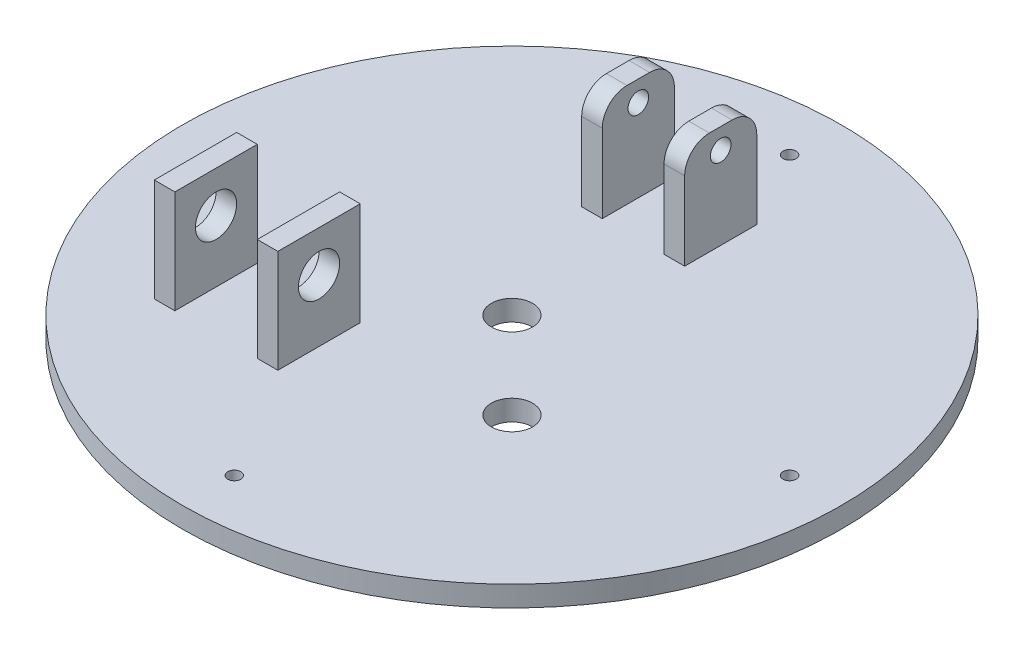
ISO-10303-21;
HEADER;
FILE_DESCRIPTION(('STEP AP214'),'2;1');
FILE_NAME('part.step','',(''),(''),'','','');
FILE_SCHEMA(('AUTOMOTIVE_DESIGN { 1 0 10303 214 1 1 1 1 }'));
ENDSEC;
DATA;
#1=APPLICATION_CONTEXT('core data for automotive mechanical design processes');
#2=APPLICATION_PROTOCOL_DEFINITION('international standard','automotive_design',2000,#1);
#3=PRODUCT_CONTEXT('',#1,'mechanical');
#4=PRODUCT('Part','Part','',(#3));
#5=PRODUCT_RELATED_PRODUCT_CATEGORY('part','',(#4));
#6=PRODUCT_DEFINITION_FORMATION('','',#4);
#7=PRODUCT_DEFINITION_CONTEXT('part definition',#1,'design');
#8=PRODUCT_DEFINITION('design','',#6,#7);
#9=PRODUCT_DEFINITION_SHAPE('','',#8);
#10=(LENGTH_UNIT() NAMED_UNIT(*) SI_UNIT(.MILLI.,.METRE.));
#11=(NAMED_UNIT(*) PLANE_ANGLE_UNIT() SI_UNIT($,.RADIAN.));
#12=(NAMED_UNIT(*) SI_UNIT($,.STERADIAN.) SOLID_ANGLE_UNIT());
#13=UNCERTAINTY_MEASURE_WITH_UNIT(LENGTH_MEASURE(1.E-05),#10,'distance_accuracy_value','');
#14=(GEOMETRIC_REPRESENTATION_CONTEXT(3) GLOBAL_UNCERTAINTY_ASSIGNED_CONTEXT((#13)) GLOBAL_UNIT_ASSIGNED_CONTEXT((#10,
#11,#12)) REPRESENTATION_CONTEXT('',''));
#15=CARTESIAN_POINT('',(0.,0.,0.));
#16=DIRECTION('',(0.,0.,1.));
#17=DIRECTION('',(1.,0.,0.));
#18=AXIS2_PLACEMENT_3D('',#15,#16,#17);
#19=CARTESIAN_POINT('',(0.,6.35,0.));
#20=DIRECTION('',(0.,1.,0.));
#21=DIRECTION('',(0.,0.,1.));
#22=AXIS2_PLACEMENT_3D('',#19,#20,#21);
#23=PLANE('',#22);
#24=CARTESIAN_POINT('',(26.6623804234543,6.35,26.6623804234543));
#25=DIRECTION('',(0.,1.,0.));
#26=DIRECTION('',(0.,0.,1.));
#27=AXIS2_PLACEMENT_3D('',#24,#25,#26);
#28=CIRCLE('',#27,6.35000000000001);
#29=CARTESIAN_POINT('',(26.6623804234543,6.35,33.0123804234543));
#30=VERTEX_POINT('',#29);
#31=EDGE_CURVE('E519',#30,#30,#28,.T.);
#32=ORIENTED_EDGE('',*,*,#31,.F.);
#33=EDGE_LOOP('',(#32));
#34=FACE_BOUND('',#33,.T.);
#35=CARTESIAN_POINT('',(0.,6.35,85.5998013460312));
#36=DIRECTION('',(0.,1.,0.));
#37=DIRECTION('',(0.,0.,1.));
#38=AXIS2_PLACEMENT_3D('',#35,#36,#37);
#39=CIRCLE('',#38,2.0193);
#40=CARTESIAN_POINT('',(0.,6.35,87.6191013460312));
#41=VERTEX_POINT('',#40);
#42=EDGE_CURVE('E331',#41,#41,#39,.T.);
#43=ORIENTED_EDGE('',*,*,#42,.F.);
#44=EDGE_LOOP('',(#43));
#45=FACE_BOUND('',#44,.T.);
#46=CARTESIAN_POINT('',(85.5998013460311,6.35,0.));
#47=DIRECTION('',(0.,1.,0.));
#48=DIRECTION('',(0.,0.,1.));
#49=AXIS2_PLACEMENT_3D('',#46,#47,#48);
#50=CIRCLE('',#49,2.0193);
#51=CARTESIAN_POINT('',(85.5998013460311,6.35,2.01929999999999));
#52=VERTEX_POINT('',#51);
#53=EDGE_CURVE('E327',#52,#52,#50,.T.);
#54=ORIENTED_EDGE('',*,*,#53,.F.);
#55=EDGE_LOOP('',(#54));
#56=FACE_BOUND('',#55,.T.);
#57=CARTESIAN_POINT('',(0.,6.35,-85.5998013460312));
#58=DIRECTION('',(0.,1.,0.));
#59=DIRECTION('',(0.,0.,1.));
#60=AXIS2_PLACEMENT_3D('',#57,#58,#59);
#61=CIRCLE('',#60,2.0193);
#62=CARTESIAN_POINT('',(0.,6.35,-83.5805013460312));
#63=VERTEX_POINT('',#62);
#64=EDGE_CURVE('E323',#63,#63,#61,.T.);
#65=ORIENTED_EDGE('',*,*,#64,.F.);
#66=EDGE_LOOP('',(#65));
#67=FACE_BOUND('',#66,.T.);
#68=CARTESIAN_POINT('',(-85.5998013460312,6.35,0.));
#69=DIRECTION('',(0.,1.,0.));
#70=DIRECTION('',(0.,0.,1.));
#71=AXIS2_PLACEMENT_3D('',#68,#69,#70);
#72=CIRCLE('',#71,2.0193);
#73=CARTESIAN_POINT('',(-85.5998013460312,6.35,2.01930000000001));
#74=VERTEX_POINT('',#73);
#75=EDGE_CURVE('E318',#74,#74,#72,.T.);
#76=ORIENTED_EDGE('',*,*,#75,.F.);
#77=EDGE_LOOP('',(#76));
#78=FACE_BOUND('',#77,.T.);
#79=DIRECTION('',(1.,0.,0.));
#80=VECTOR('',#79,1.);
#81=CARTESIAN_POINT('',(-18.18767,6.35,-39.6875));
#82=LINE('',#81,#80);
#83=CARTESIAN_POINT('',(-18.18767,6.35,-39.6875));
#84=VERTEX_POINT('',#83);
#85=CARTESIAN_POINT('',(-11.83767,6.35,-39.6875));
#86=VERTEX_POINT('',#85);
#87=EDGE_CURVE('E220',#84,#86,#82,.T.);
#88=ORIENTED_EDGE('',*,*,#87,.F.);
#89=DIRECTION('',(0.,0.,1.));
#90=VECTOR('',#89,1.);
#91=CARTESIAN_POINT('',(-18.18767,6.35,-39.6875));
#92=LINE('',#91,#90);
#93=CARTESIAN_POINT('',(-18.18767,6.35,-61.9125));
#94=VERTEX_POINT('',#93);
#95=EDGE_CURVE('E183',#94,#84,#92,.T.);
#96=ORIENTED_EDGE('',*,*,#95,.F.);
#97=DIRECTION('',(-1.,0.,0.));
#98=VECTOR('',#97,1.);
#99=CARTESIAN_POINT('',(-18.18767,6.35,-61.9125));
#100=LINE('',#99,#98);
#101=CARTESIAN_POINT('',(-11.83767,6.35,-61.9125));
#102=VERTEX_POINT('',#101);
#103=EDGE_CURVE('E214',#102,#94,#100,.T.);
#104=ORIENTED_EDGE('',*,*,#103,.F.);
#105=DIRECTION('',(0.,0.,-1.));
#106=VECTOR('',#105,1.);
#107=CARTESIAN_POINT('',(-11.83767,6.35,-39.6875));
#108=LINE('',#107,#106);
#109=EDGE_CURVE('E223',#86,#102,#108,.T.);
#110=ORIENTED_EDGE('',*,*,#109,.F.);
#111=EDGE_LOOP('',(#88,#96,#104,#110));
#112=FACE_BOUND('',#111,.T.);
#113=DIRECTION('',(1.,0.,0.));
#114=VECTOR('',#113,1.);
#115=CARTESIAN_POINT('',(-59.46267,6.35,50.8));
#116=LINE('',#115,#114);
#117=CARTESIAN_POINT('',(-59.46267,6.35,50.8));
#118=VERTEX_POINT('',#117);
#119=CARTESIAN_POINT('',(-53.11267,6.35,50.8));
#120=VERTEX_POINT('',#119);
#121=EDGE_CURVE('E290',#118,#120,#116,.T.);
#122=ORIENTED_EDGE('',*,*,#121,.F.);
#123=DIRECTION('',(0.,0.,1.));
#124=VECTOR('',#123,1.);
#125=CARTESIAN_POINT('',(-59.46267,6.35,25.4));
#126=LINE('',#125,#124);
#127=CARTESIAN_POINT('',(-59.46267,6.35,25.4));
#128=VERTEX_POINT('',#127);
#129=EDGE_CURVE('E276',#128,#118,#126,.T.);
#130=ORIENTED_EDGE('',*,*,#129,.F.);
#131=DIRECTION('',(-1.,0.,0.));
#132=VECTOR('',#131,1.);
#133=CARTESIAN_POINT('',(-59.46267,6.35,25.4));
#134=LINE('',#133,#132);
#135=CARTESIAN_POINT('',(-53.11267,6.35,25.4));
#136=VERTEX_POINT('',#135);
#137=EDGE_CURVE('E281',#136,#128,#134,.T.);
#138=ORIENTED_EDGE('',*,*,#137,.F.);
#139=DIRECTION('',(0.,0.,-1.));
#140=VECTOR('',#139,1.);
#141=CARTESIAN_POINT('',(-53.11267,6.35,25.4));
#142=LINE('',#141,#140);
#143=EDGE_CURVE('E292',#120,#136,#142,.T.);
#144=ORIENTED_EDGE('',*,*,#143,.F.);
#145=EDGE_LOOP('',(#122,#130,#138,#144));
#146=FACE_BOUND('',#145,.T.);
#147=CARTESIAN_POINT('',(0.,6.35,0.));
#148=DIRECTION('',(0.,-1.,0.));
#149=DIRECTION('',(0.,0.,-1.));
#150=AXIS2_PLACEMENT_3D('',#147,#148,#149);
#151=CIRCLE('',#150,6.35);
#152=CARTESIAN_POINT('',(0.,6.35,-6.35));
#153=VERTEX_POINT('',#152);
#154=EDGE_CURVE('E306',#153,#153,#151,.T.);
#155=ORIENTED_EDGE('',*,*,#154,.T.);
#156=EDGE_LOOP('',(#155));
#157=FACE_BOUND('',#156,.T.);
#158=CARTESIAN_POINT('',(0.,6.35,0.));
#159=DIRECTION('',(0.,1.,0.));
#160=DIRECTION('',(0.,0.,1.));
#161=AXIS2_PLACEMENT_3D('',#158,#159,#160);
#162=CIRCLE('',#161,101.6);
#163=CARTESIAN_POINT('',(0.,6.35,101.6));
#164=VERTEX_POINT('',#163);
#165=EDGE_CURVE('E312',#164,#164,#162,.T.);
#166=ORIENTED_EDGE('',*,*,#165,.T.);
#167=EDGE_LOOP('',(#166));
#168=FACE_BOUND('',#167,.T.);
#169=DIRECTION('',(1.,0.,0.));
#170=VECTOR('',#169,1.);
#171=CARTESIAN_POINT('',(-27.71267,6.35,50.8));
#172=LINE('',#171,#170);
#173=CARTESIAN_POINT('',(-27.71267,6.35,50.8));
#174=VERTEX_POINT('',#173);
#175=CARTESIAN_POINT('',(-21.36267,6.35,50.8));
#176=VERTEX_POINT('',#175);
#177=EDGE_CURVE('E261',#174,#176,#172,.T.);
#178=ORIENTED_EDGE('',*,*,#177,.F.);
#179=DIRECTION('',(0.,0.,1.));
#180=VECTOR('',#179,1.);
#181=CARTESIAN_POINT('',(-27.71267,6.35,25.4));
#182=LINE('',#181,#180);
#183=CARTESIAN_POINT('',(-27.71267,6.35,25.4));
#184=VERTEX_POINT('',#183);
#185=EDGE_CURVE('E247',#184,#174,#182,.T.);
#186=ORIENTED_EDGE('',*,*,#185,.F.);
#187=DIRECTION('',(-1.,0.,0.));
#188=VECTOR('',#187,1.);
#189=CARTESIAN_POINT('',(-27.71267,6.35,25.4));
#190=LINE('',#189,#188);
#191=CARTESIAN_POINT('',(-21.36267,6.35,25.4));
#192=VERTEX_POINT('',#191);
#193=EDGE_CURVE('E252',#192,#184,#190,.T.);
#194=ORIENTED_EDGE('',*,*,#193,.F.);
#195=DIRECTION('',(0.,0.,-1.));
#196=VECTOR('',#195,1.);
#197=CARTESIAN_POINT('',(-21.36267,6.35,25.4));
#198=LINE('',#197,#196);
#199=EDGE_CURVE('E263',#176,#192,#198,.T.);
#200=ORIENTED_EDGE('',*,*,#199,.F.);
#201=EDGE_LOOP('',(#178,#186,#194,#200));
#202=FACE_BOUND('',#201,.T.);
#203=DIRECTION('',(1.,0.,0.));
#204=VECTOR('',#203,1.);
#205=CARTESIAN_POINT('',(7.21233,6.35,-39.6875));
#206=LINE('',#205,#204);
#207=CARTESIAN_POINT('',(7.21233,6.35,-39.6875));
#208=VERTEX_POINT('',#207);
#209=CARTESIAN_POINT('',(13.56233,6.35,-39.6875));
#210=VERTEX_POINT('',#209);
#211=EDGE_CURVE('E177',#208,#210,#206,.T.);
#212=ORIENTED_EDGE('',*,*,#211,.F.);
#213=DIRECTION('',(0.,0.,1.));
#214=VECTOR('',#213,1.);
#215=CARTESIAN_POINT('',(7.21233,6.35,-61.9125));
#216=LINE('',#215,#214);
#217=CARTESIAN_POINT('',(7.21233,6.35,-61.9125));
#218=VERTEX_POINT('',#217);
#219=EDGE_CURVE('E187',#218,#208,#216,.T.);
#220=ORIENTED_EDGE('',*,*,#219,.F.);
#221=DIRECTION('',(-1.,0.,0.));
#222=VECTOR('',#221,1.);
#223=CARTESIAN_POINT('',(7.21233,6.35,-61.9125));
#224=LINE('',#223,#222);
#225=CARTESIAN_POINT('',(13.56233,6.35,-61.9125));
#226=VERTEX_POINT('',#225);
#227=EDGE_CURVE('E199',#226,#218,#224,.T.);
#228=ORIENTED_EDGE('',*,*,#227,.F.);
#229=DIRECTION('',(0.,0.,-1.));
#230=VECTOR('',#229,1.);
#231=CARTESIAN_POINT('',(13.56233,6.35,-61.9125));
#232=LINE('',#231,#230);
#233=EDGE_CURVE('E197',#210,#226,#232,.T.);
#234=ORIENTED_EDGE('',*,*,#233,.F.);
#235=EDGE_LOOP('',(#212,#220,#228,#234));
#236=FACE_BOUND('',#235,.T.);
#237=ADVANCED_FACE('F35',(#34,#45,#56,#67,#78,#112,#146,#157,#168,#202,#236),#23,.T.);
#238=CARTESIAN_POINT('',(0.,6.35,0.));
#239=DIRECTION('',(0.,-1.,0.));
#240=DIRECTION('',(0.,0.,-1.));
#241=AXIS2_PLACEMENT_3D('',#238,#239,#240);
#242=CYLINDRICAL_SURFACE('',#241,101.6);
#243=ORIENTED_EDGE('',*,*,#165,.F.);
#244=EDGE_LOOP('',(#243));
#245=FACE_BOUND('',#244,.T.);
#246=CARTESIAN_POINT('',(0.,0.,0.));
#247=DIRECTION('',(0.,1.,0.));
#248=DIRECTION('',(0.,0.,1.));
#249=AXIS2_PLACEMENT_3D('',#246,#247,#248);
#250=CIRCLE('',#249,101.6);
#251=CARTESIAN_POINT('',(0.,0.,101.6));
#252=VERTEX_POINT('',#251);
#253=EDGE_CURVE('E309',#252,#252,#250,.T.);
#254=ORIENTED_EDGE('',*,*,#253,.T.);
#255=EDGE_LOOP('',(#254));
#256=FACE_BOUND('',#255,.T.);
#257=ADVANCED_FACE('F388',(#245,#256),#242,.T.);
#258=CARTESIAN_POINT('',(0.,0.,0.));
#259=DIRECTION('',(0.,1.,0.));
#260=DIRECTION('',(0.,0.,1.));
#261=AXIS2_PLACEMENT_3D('',#258,#259,#260);
#262=PLANE('',#261);
#263=CARTESIAN_POINT('',(26.6623804234543,0.,26.6623804234543));
#264=DIRECTION('',(0.,1.,0.));
#265=DIRECTION('',(0.,0.,1.));
#266=AXIS2_PLACEMENT_3D('',#263,#264,#265);
#267=CIRCLE('',#266,6.35000000000001);
#268=CARTESIAN_POINT('',(26.6623804234543,0.,33.0123804234543));
#269=VERTEX_POINT('',#268);
#270=EDGE_CURVE('E518',#269,#269,#267,.T.);
#271=ORIENTED_EDGE('',*,*,#270,.T.);
#272=EDGE_LOOP('',(#271));
#273=FACE_BOUND('',#272,.T.);
#274=CARTESIAN_POINT('',(0.,0.,85.5998013460312));
#275=DIRECTION('',(0.,-1.,0.));
#276=DIRECTION('',(0.,0.,-1.));
#277=AXIS2_PLACEMENT_3D('',#274,#275,#276);
#278=CIRCLE('',#277,2.0193);
#279=CARTESIAN_POINT('',(0.,0.,83.5805013460312));
#280=VERTEX_POINT('',#279);
#281=EDGE_CURVE('E334',#280,#280,#278,.T.);
#282=ORIENTED_EDGE('',*,*,#281,.F.);
#283=EDGE_LOOP('',(#282));
#284=FACE_BOUND('',#283,.T.);
#285=CARTESIAN_POINT('',(85.5998013460311,0.,0.));
#286=DIRECTION('',(0.,-1.,0.));
#287=DIRECTION('',(0.,0.,-1.));
#288=AXIS2_PLACEMENT_3D('',#285,#286,#287);
#289=CIRCLE('',#288,2.0193);
#290=CARTESIAN_POINT('',(85.5998013460311,0.,-2.01930000000002));
#291=VERTEX_POINT('',#290);
#292=EDGE_CURVE('E330',#291,#291,#289,.T.);
#293=ORIENTED_EDGE('',*,*,#292,.F.);
#294=EDGE_LOOP('',(#293));
#295=FACE_BOUND('',#294,.T.);
#296=CARTESIAN_POINT('',(0.,0.,-85.5998013460312));
#297=DIRECTION('',(0.,-1.,0.));
#298=DIRECTION('',(0.,0.,-1.));
#299=AXIS2_PLACEMENT_3D('',#296,#297,#298);
#300=CIRCLE('',#299,2.0193);
#301=CARTESIAN_POINT('',(0.,0.,-87.6191013460312));
#302=VERTEX_POINT('',#301);
#303=EDGE_CURVE('E326',#302,#302,#300,.T.);
#304=ORIENTED_EDGE('',*,*,#303,.F.);
#305=EDGE_LOOP('',(#304));
#306=FACE_BOUND('',#305,.T.);
#307=CARTESIAN_POINT('',(-85.5998013460312,0.,0.));
#308=DIRECTION('',(0.,-1.,0.));
#309=DIRECTION('',(0.,0.,-1.));
#310=AXIS2_PLACEMENT_3D('',#307,#308,#309);
#311=CIRCLE('',#310,2.0193);
#312=CARTESIAN_POINT('',(-85.5998013460312,0.,-2.01929999999999));
#313=VERTEX_POINT('',#312);
#314=EDGE_CURVE('E322',#313,#313,#311,.T.);
#315=ORIENTED_EDGE('',*,*,#314,.F.);
#316=EDGE_LOOP('',(#315));
#317=FACE_BOUND('',#316,.T.);
#318=CARTESIAN_POINT('',(0.,0.,0.));
#319=DIRECTION('',(0.,-1.,0.));
#320=DIRECTION('',(0.,0.,-1.));
#321=AXIS2_PLACEMENT_3D('',#318,#319,#320);
#322=CIRCLE('',#321,6.35);
#323=CARTESIAN_POINT('',(0.,0.,-6.35));
#324=VERTEX_POINT('',#323);
#325=EDGE_CURVE('E305',#324,#324,#322,.T.);
#326=ORIENTED_EDGE('',*,*,#325,.F.);
#327=EDGE_LOOP('',(#326));
#328=FACE_BOUND('',#327,.T.);
#329=ORIENTED_EDGE('',*,*,#253,.F.);
#330=EDGE_LOOP('',(#329));
#331=FACE_BOUND('',#330,.T.);
#332=ADVANCED_FACE('F459',(#273,#284,#295,#306,#317,#328,#331),#262,.F.);
#333=CARTESIAN_POINT('',(0.,6.35,0.));
#334=DIRECTION('',(0.,-1.,0.));
#335=DIRECTION('',(0.,0.,-1.));
#336=AXIS2_PLACEMENT_3D('',#333,#334,#335);
#337=CYLINDRICAL_SURFACE('',#336,6.35);
#338=ORIENTED_EDGE('',*,*,#154,.F.);
#339=EDGE_LOOP('',(#338));
#340=FACE_BOUND('',#339,.T.);
#341=ORIENTED_EDGE('',*,*,#325,.T.);
#342=EDGE_LOOP('',(#341));
#343=FACE_BOUND('',#342,.T.);
#344=ADVANCED_FACE('F456',(#340,#343),#337,.F.);
#345=CARTESIAN_POINT('',(-59.46267,38.1,25.4));
#346=DIRECTION('',(1.,0.,0.));
#347=DIRECTION('',(0.,0.,-1.));
#348=AXIS2_PLACEMENT_3D('',#345,#346,#347);
#349=PLANE('',#348);
#350=CARTESIAN_POINT('',(-59.46267,25.4,38.1));
#351=DIRECTION('',(1.,0.,0.));
#352=DIRECTION('',(0.,0.,-1.));
#353=AXIS2_PLACEMENT_3D('',#350,#351,#352);
#354=CIRCLE('',#353,6.35);
#355=CARTESIAN_POINT('',(-59.46267,25.4,31.75));
#356=VERTEX_POINT('',#355);
#357=EDGE_CURVE('E238',#356,#356,#354,.F.);
#358=ORIENTED_EDGE('',*,*,#357,.F.);
#359=EDGE_LOOP('',(#358));
#360=FACE_BOUND('',#359,.T.);
#361=ORIENTED_EDGE('',*,*,#129,.T.);
#362=DIRECTION('',(0.,-1.,0.));
#363=VECTOR('',#362,1.);
#364=CARTESIAN_POINT('',(-59.46267,38.1,50.8));
#365=LINE('',#364,#363);
#366=CARTESIAN_POINT('',(-59.46267,38.1,50.8));
#367=VERTEX_POINT('',#366);
#368=EDGE_CURVE('E303',#367,#118,#365,.T.);
#369=ORIENTED_EDGE('',*,*,#368,.F.);
#370=DIRECTION('',(0.,0.,1.));
#371=VECTOR('',#370,1.);
#372=CARTESIAN_POINT('',(-59.46267,38.1,25.4));
#373=LINE('',#372,#371);
#374=CARTESIAN_POINT('',(-59.46267,38.1,25.4));
#375=VERTEX_POINT('',#374);
#376=EDGE_CURVE('E277',#375,#367,#373,.T.);
#377=ORIENTED_EDGE('',*,*,#376,.F.);
#378=DIRECTION('',(0.,-1.,0.));
#379=VECTOR('',#378,1.);
#380=CARTESIAN_POINT('',(-59.46267,38.1,25.4));
#381=LINE('',#380,#379);
#382=EDGE_CURVE('E287',#375,#128,#381,.T.);
#383=ORIENTED_EDGE('',*,*,#382,.T.);
#384=EDGE_LOOP('',(#361,#369,#377,#383));
#385=FACE_BOUND('',#384,.T.);
#386=ADVANCED_FACE('F452',(#360,#385),#349,.F.);
#387=CARTESIAN_POINT('',(-59.46267,38.1,50.8));
#388=DIRECTION('',(0.,0.,-1.));
#389=DIRECTION('',(-1.,0.,0.));
#390=AXIS2_PLACEMENT_3D('',#387,#388,#389);
#391=PLANE('',#390);
#392=ORIENTED_EDGE('',*,*,#121,.T.);
#393=DIRECTION('',(0.,-1.,0.));
#394=VECTOR('',#393,1.);
#395=CARTESIAN_POINT('',(-53.11267,38.1,50.8));
#396=LINE('',#395,#394);
#397=CARTESIAN_POINT('',(-53.11267,38.1,50.8));
#398=VERTEX_POINT('',#397);
#399=EDGE_CURVE('E300',#398,#120,#396,.T.);
#400=ORIENTED_EDGE('',*,*,#399,.F.);
#401=DIRECTION('',(1.,0.,0.));
#402=VECTOR('',#401,1.);
#403=CARTESIAN_POINT('',(-59.46267,38.1,50.8));
#404=LINE('',#403,#402);
#405=EDGE_CURVE('E280',#367,#398,#404,.T.);
#406=ORIENTED_EDGE('',*,*,#405,.F.);
#407=ORIENTED_EDGE('',*,*,#368,.T.);
#408=EDGE_LOOP('',(#392,#400,#406,#407));
#409=FACE_BOUND('',#408,.T.);
#410=ADVANCED_FACE('F448',(#409),#391,.F.);
#411=CARTESIAN_POINT('',(-53.11267,38.1,25.4));
#412=DIRECTION('',(-1.,0.,0.));
#413=DIRECTION('',(0.,0.,1.));
#414=AXIS2_PLACEMENT_3D('',#411,#412,#413);
#415=PLANE('',#414);
#416=CARTESIAN_POINT('',(-53.11267,25.4,38.1));
#417=DIRECTION('',(-1.,0.,0.));
#418=DIRECTION('',(0.,0.,1.));
#419=AXIS2_PLACEMENT_3D('',#416,#417,#418);
#420=CIRCLE('',#419,6.35);
#421=CARTESIAN_POINT('',(-53.11267,25.4,44.45));
#422=VERTEX_POINT('',#421);
#423=EDGE_CURVE('E244',#422,#422,#420,.T.);
#424=ORIENTED_EDGE('',*,*,#423,.T.);
#425=EDGE_LOOP('',(#424));
#426=FACE_BOUND('',#425,.T.);
#427=ORIENTED_EDGE('',*,*,#143,.T.);
#428=DIRECTION('',(0.,-1.,0.));
#429=VECTOR('',#428,1.);
#430=CARTESIAN_POINT('',(-53.11267,38.1,25.4));
#431=LINE('',#430,#429);
#432=CARTESIAN_POINT('',(-53.11267,38.1,25.4));
#433=VERTEX_POINT('',#432);
#434=EDGE_CURVE('E298',#433,#136,#431,.T.);
#435=ORIENTED_EDGE('',*,*,#434,.F.);
#436=DIRECTION('',(0.,0.,-1.));
#437=VECTOR('',#436,1.);
#438=CARTESIAN_POINT('',(-53.11267,38.1,25.4));
#439=LINE('',#438,#437);
#440=EDGE_CURVE('E283',#398,#433,#439,.T.);
#441=ORIENTED_EDGE('',*,*,#440,.F.);
#442=ORIENTED_EDGE('',*,*,#399,.T.);
#443=EDGE_LOOP('',(#427,#435,#441,#442));
#444=FACE_BOUND('',#443,.T.);
#445=ADVANCED_FACE('F444',(#426,#444),#415,.F.);
#446=CARTESIAN_POINT('',(-59.46267,38.1,25.4));
#447=DIRECTION('',(0.,0.,1.));
#448=DIRECTION('',(1.,0.,0.));
#449=AXIS2_PLACEMENT_3D('',#446,#447,#448);
#450=PLANE('',#449);
#451=ORIENTED_EDGE('',*,*,#137,.T.);
#452=ORIENTED_EDGE('',*,*,#382,.F.);
#453=DIRECTION('',(-1.,0.,0.));
#454=VECTOR('',#453,1.);
#455=CARTESIAN_POINT('',(-59.46267,38.1,25.4));
#456=LINE('',#455,#454);
#457=EDGE_CURVE('E285',#433,#375,#456,.T.);
#458=ORIENTED_EDGE('',*,*,#457,.F.);
#459=ORIENTED_EDGE('',*,*,#434,.T.);
#460=EDGE_LOOP('',(#451,#452,#458,#459));
#461=FACE_BOUND('',#460,.T.);
#462=ADVANCED_FACE('F440',(#461),#450,.F.);
#463=CARTESIAN_POINT('',(0.,38.1,0.));
#464=DIRECTION('',(0.,1.,0.));
#465=DIRECTION('',(0.,0.,1.));
#466=AXIS2_PLACEMENT_3D('',#463,#464,#465);
#467=PLANE('',#466);
#468=ORIENTED_EDGE('',*,*,#376,.T.);
#469=ORIENTED_EDGE('',*,*,#405,.T.);
#470=ORIENTED_EDGE('',*,*,#440,.T.);
#471=ORIENTED_EDGE('',*,*,#457,.T.);
#472=EDGE_LOOP('',(#468,#469,#470,#471));
#473=FACE_BOUND('',#472,.T.);
#474=ADVANCED_FACE('F436',(#473),#467,.T.);
#475=CARTESIAN_POINT('',(-27.71267,38.1,25.4));
#476=DIRECTION('',(1.,0.,0.));
#477=DIRECTION('',(0.,0.,-1.));
#478=AXIS2_PLACEMENT_3D('',#475,#476,#477);
#479=PLANE('',#478);
#480=CARTESIAN_POINT('',(-27.71267,25.4,38.1));
#481=DIRECTION('',(1.,0.,0.));
#482=DIRECTION('',(0.,0.,-1.));
#483=AXIS2_PLACEMENT_3D('',#480,#481,#482);
#484=CIRCLE('',#483,6.35);
#485=CARTESIAN_POINT('',(-27.71267,25.4,31.75));
#486=VERTEX_POINT('',#485);
#487=EDGE_CURVE('E241',#486,#486,#484,.T.);
#488=ORIENTED_EDGE('',*,*,#487,.T.);
#489=EDGE_LOOP('',(#488));
#490=FACE_BOUND('',#489,.T.);
#491=ORIENTED_EDGE('',*,*,#185,.T.);
#492=DIRECTION('',(0.,-1.,0.));
#493=VECTOR('',#492,1.);
#494=CARTESIAN_POINT('',(-27.71267,38.1,50.8));
#495=LINE('',#494,#493);
#496=CARTESIAN_POINT('',(-27.71267,38.1,50.8));
#497=VERTEX_POINT('',#496);
#498=EDGE_CURVE('E274',#497,#174,#495,.T.);
#499=ORIENTED_EDGE('',*,*,#498,.F.);
#500=DIRECTION('',(0.,0.,1.));
#501=VECTOR('',#500,1.);
#502=CARTESIAN_POINT('',(-27.71267,38.1,25.4));
#503=LINE('',#502,#501);
#504=CARTESIAN_POINT('',(-27.71267,38.1,25.4));
#505=VERTEX_POINT('',#504);
#506=EDGE_CURVE('E248',#505,#497,#503,.T.);
#507=ORIENTED_EDGE('',*,*,#506,.F.);
#508=DIRECTION('',(0.,-1.,0.));
#509=VECTOR('',#508,1.);
#510=CARTESIAN_POINT('',(-27.71267,38.1,25.4));
#511=LINE('',#510,#509);
#512=EDGE_CURVE('E258',#505,#184,#511,.T.);
#513=ORIENTED_EDGE('',*,*,#512,.T.);
#514=EDGE_LOOP('',(#491,#499,#507,#513));
#515=FACE_BOUND('',#514,.T.);
#516=ADVANCED_FACE('F417',(#490,#515),#479,.F.);
#517=CARTESIAN_POINT('',(-27.71267,38.1,50.8));
#518=DIRECTION('',(0.,0.,-1.));
#519=DIRECTION('',(-1.,0.,0.));
#520=AXIS2_PLACEMENT_3D('',#517,#518,#519);
#521=PLANE('',#520);
#522=ORIENTED_EDGE('',*,*,#177,.T.);
#523=DIRECTION('',(0.,-1.,0.));
#524=VECTOR('',#523,1.);
#525=CARTESIAN_POINT('',(-21.36267,38.1,50.8));
#526=LINE('',#525,#524);
#527=CARTESIAN_POINT('',(-21.36267,38.1,50.8));
#528=VERTEX_POINT('',#527);
#529=EDGE_CURVE('E271',#528,#176,#526,.T.);
#530=ORIENTED_EDGE('',*,*,#529,.F.);
#531=DIRECTION('',(1.,0.,0.));
#532=VECTOR('',#531,1.);
#533=CARTESIAN_POINT('',(-27.71267,38.1,50.8));
#534=LINE('',#533,#532);
#535=EDGE_CURVE('E251',#497,#528,#534,.T.);
#536=ORIENTED_EDGE('',*,*,#535,.F.);
#537=ORIENTED_EDGE('',*,*,#498,.T.);
#538=EDGE_LOOP('',(#522,#530,#536,#537));
#539=FACE_BOUND('',#538,.T.);
#540=ADVANCED_FACE('F405',(#539),#521,.F.);
#541=CARTESIAN_POINT('',(-21.36267,38.1,25.4));
#542=DIRECTION('',(-1.,0.,0.));
#543=DIRECTION('',(0.,0.,1.));
#544=AXIS2_PLACEMENT_3D('',#541,#542,#543);
#545=PLANE('',#544);
#546=CARTESIAN_POINT('',(-21.36267,25.4,38.1));
#547=DIRECTION('',(1.,0.,0.));
#548=DIRECTION('',(0.,0.,-1.));
#549=AXIS2_PLACEMENT_3D('',#546,#547,#548);
#550=CIRCLE('',#549,6.35);
#551=CARTESIAN_POINT('',(-21.36267,25.4,31.75));
#552=VERTEX_POINT('',#551);
#553=EDGE_CURVE('E235',#552,#552,#550,.T.);
#554=ORIENTED_EDGE('',*,*,#553,.F.);
#555=EDGE_LOOP('',(#554));
#556=FACE_BOUND('',#555,.T.);
#557=ORIENTED_EDGE('',*,*,#199,.T.);
#558=DIRECTION('',(0.,-1.,0.));
#559=VECTOR('',#558,1.);
#560=CARTESIAN_POINT('',(-21.36267,38.1,25.4));
#561=LINE('',#560,#559);
#562=CARTESIAN_POINT('',(-21.36267,38.1,25.4));
#563=VERTEX_POINT('',#562);
#564=EDGE_CURVE('E269',#563,#192,#561,.T.);
#565=ORIENTED_EDGE('',*,*,#564,.F.);
#566=DIRECTION('',(0.,0.,-1.));
#567=VECTOR('',#566,1.);
#568=CARTESIAN_POINT('',(-21.36267,38.1,25.4));
#569=LINE('',#568,#567);
#570=EDGE_CURVE('E254',#528,#563,#569,.T.);
#571=ORIENTED_EDGE('',*,*,#570,.F.);
#572=ORIENTED_EDGE('',*,*,#529,.T.);
#573=EDGE_LOOP('',(#557,#565,#571,#572));
#574=FACE_BOUND('',#573,.T.);
#575=ADVANCED_FACE('F409',(#556,#574),#545,.F.);
#576=CARTESIAN_POINT('',(-27.71267,38.1,25.4));
#577=DIRECTION('',(0.,0.,1.));
#578=DIRECTION('',(1.,0.,0.));
#579=AXIS2_PLACEMENT_3D('',#576,#577,#578);
#580=PLANE('',#579);
#581=ORIENTED_EDGE('',*,*,#193,.T.);
#582=ORIENTED_EDGE('',*,*,#512,.F.);
#583=DIRECTION('',(-1.,0.,0.));
#584=VECTOR('',#583,1.);
#585=CARTESIAN_POINT('',(-27.71267,38.1,25.4));
#586=LINE('',#585,#584);
#587=EDGE_CURVE('E256',#563,#505,#586,.T.);
#588=ORIENTED_EDGE('',*,*,#587,.F.);
#589=ORIENTED_EDGE('',*,*,#564,.T.);
#590=EDGE_LOOP('',(#581,#582,#588,#589));
#591=FACE_BOUND('',#590,.T.);
#592=ADVANCED_FACE('F419',(#591),#580,.F.);
#593=CARTESIAN_POINT('',(0.,38.1,0.));
#594=DIRECTION('',(0.,1.,0.));
#595=DIRECTION('',(0.,0.,1.));
#596=AXIS2_PLACEMENT_3D('',#593,#594,#595);
#597=PLANE('',#596);
#598=ORIENTED_EDGE('',*,*,#506,.T.);
#599=ORIENTED_EDGE('',*,*,#535,.T.);
#600=ORIENTED_EDGE('',*,*,#570,.T.);
#601=ORIENTED_EDGE('',*,*,#587,.T.);
#602=EDGE_LOOP('',(#598,#599,#600,#601));
#603=FACE_BOUND('',#602,.T.);
#604=ADVANCED_FACE('F413',(#603),#597,.T.);
#605=CARTESIAN_POINT('',(-77.4231822421383,25.4,38.1));
#606=DIRECTION('',(1.,0.,0.));
#607=DIRECTION('',(0.,0.,-1.));
#608=AXIS2_PLACEMENT_3D('',#605,#606,#607);
#609=CYLINDRICAL_SURFACE('',#608,6.35);
#610=ORIENTED_EDGE('',*,*,#553,.T.);
#611=EDGE_LOOP('',(#610));
#612=FACE_BOUND('',#611,.T.);
#613=ORIENTED_EDGE('',*,*,#487,.F.);
#614=EDGE_LOOP('',(#613));
#615=FACE_BOUND('',#614,.T.);
#616=ADVANCED_FACE('F426',(#612,#615),#609,.F.);
#617=ORIENTED_EDGE('',*,*,#357,.T.);
#618=EDGE_LOOP('',(#617));
#619=FACE_BOUND('',#618,.T.);
#620=ORIENTED_EDGE('',*,*,#423,.F.);
#621=EDGE_LOOP('',(#620));
#622=FACE_BOUND('',#621,.T.);
#623=ADVANCED_FACE('F586',(#619,#622),#609,.F.);
#624=CARTESIAN_POINT('',(-18.18767,38.1,-39.6875));
#625=DIRECTION('',(1.,0.,0.));
#626=DIRECTION('',(0.,0.,-1.));
#627=AXIS2_PLACEMENT_3D('',#624,#625,#626);
#628=PLANE('',#627);
#629=CARTESIAN_POINT('',(-18.18767,31.75,-50.8));
#630=DIRECTION('',(-1.,0.,0.));
#631=DIRECTION('',(0.,0.,1.));
#632=AXIS2_PLACEMENT_3D('',#629,#630,#631);
#633=CIRCLE('',#632,3.175);
#634=CARTESIAN_POINT('',(-18.18767,31.75,-47.625));
#635=VERTEX_POINT('',#634);
#636=EDGE_CURVE('E321',#635,#635,#633,.T.);
#637=ORIENTED_EDGE('',*,*,#636,.F.);
#638=EDGE_LOOP('',(#637));
#639=FACE_BOUND('',#638,.T.);
#640=DIRECTION('',(0.,-1.,0.));
#641=VECTOR('',#640,1.);
#642=CARTESIAN_POINT('',(-18.18767,38.1,-39.6875));
#643=LINE('',#642,#641);
#644=CARTESIAN_POINT('',(-18.18767,30.48,-39.6875));
#645=VERTEX_POINT('',#644);
#646=EDGE_CURVE('E233',#645,#84,#643,.T.);
#647=ORIENTED_EDGE('',*,*,#646,.F.);
#648=CARTESIAN_POINT('',(-18.18767,30.48,-47.3075));
#649=DIRECTION('',(1.,0.,0.));
#650=DIRECTION('',(0.,0.,-1.));
#651=AXIS2_PLACEMENT_3D('',#648,#649,#650);
#652=CIRCLE('',#651,7.62);
#653=CARTESIAN_POINT('',(-18.18767,38.1,-47.3075));
#654=VERTEX_POINT('',#653);
#655=EDGE_CURVE('E361',#645,#654,#652,.F.);
#656=ORIENTED_EDGE('',*,*,#655,.T.);
#657=DIRECTION('',(0.,0.,1.));
#658=VECTOR('',#657,1.);
#659=CARTESIAN_POINT('',(-18.18767,38.1,-39.6875));
#660=LINE('',#659,#658);
#661=CARTESIAN_POINT('',(-18.18767,38.1,-54.2925));
#662=VERTEX_POINT('',#661);
#663=EDGE_CURVE('E210',#662,#654,#660,.T.);
#664=ORIENTED_EDGE('',*,*,#663,.F.);
#665=CARTESIAN_POINT('',(-18.18767,30.48,-54.2925));
#666=DIRECTION('',(1.,0.,0.));
#667=DIRECTION('',(0.,0.,-1.));
#668=AXIS2_PLACEMENT_3D('',#665,#666,#667);
#669=CIRCLE('',#668,7.62);
#670=CARTESIAN_POINT('',(-18.18767,30.48,-61.9125));
#671=VERTEX_POINT('',#670);
#672=EDGE_CURVE('E50',#662,#671,#669,.F.);
#673=ORIENTED_EDGE('',*,*,#672,.T.);
#674=DIRECTION('',(0.,-1.,0.));
#675=VECTOR('',#674,1.);
#676=CARTESIAN_POINT('',(-18.18767,38.1,-61.9125));
#677=LINE('',#676,#675);
#678=EDGE_CURVE('E217',#671,#94,#677,.T.);
#679=ORIENTED_EDGE('',*,*,#678,.T.);
#680=ORIENTED_EDGE('',*,*,#95,.T.);
#681=EDGE_LOOP('',(#647,#656,#664,#673,#679,#680));
#682=FACE_BOUND('',#681,.T.);
#683=ADVANCED_FACE('F378',(#639,#682),#628,.F.);
#684=CARTESIAN_POINT('',(-18.18767,38.1,-39.6875));
#685=DIRECTION('',(0.,0.,-1.));
#686=DIRECTION('',(-1.,0.,0.));
#687=AXIS2_PLACEMENT_3D('',#684,#685,#686);
#688=PLANE('',#687);
#689=DIRECTION('',(0.,-1.,0.));
#690=VECTOR('',#689,1.);
#691=CARTESIAN_POINT('',(-11.83767,38.1,-39.6875));
#692=LINE('',#691,#690);
#693=CARTESIAN_POINT('',(-11.83767,30.48,-39.6875));
#694=VERTEX_POINT('',#693);
#695=EDGE_CURVE('E231',#694,#86,#692,.T.);
#696=ORIENTED_EDGE('',*,*,#695,.F.);
#697=DIRECTION('',(1.,0.,0.));
#698=VECTOR('',#697,1.);
#699=CARTESIAN_POINT('',(-18.18767,30.48,-39.6875));
#700=LINE('',#699,#698);
#701=EDGE_CURVE('E58',#694,#645,#700,.F.);
#702=ORIENTED_EDGE('',*,*,#701,.T.);
#703=ORIENTED_EDGE('',*,*,#646,.T.);
#704=ORIENTED_EDGE('',*,*,#87,.T.);
#705=EDGE_LOOP('',(#696,#702,#703,#704));
#706=FACE_BOUND('',#705,.T.);
#707=ADVANCED_FACE('F382',(#706),#688,.F.);
#708=CARTESIAN_POINT('',(-11.83767,38.1,-39.6875));
#709=DIRECTION('',(-1.,0.,0.));
#710=DIRECTION('',(0.,0.,1.));
#711=AXIS2_PLACEMENT_3D('',#708,#709,#710);
#712=PLANE('',#711);
#713=CARTESIAN_POINT('',(-11.83767,31.75,-50.8));
#714=DIRECTION('',(-1.,0.,0.));
#715=DIRECTION('',(0.,0.,1.));
#716=AXIS2_PLACEMENT_3D('',#713,#714,#715);
#717=CIRCLE('',#716,3.175);
#718=CARTESIAN_POINT('',(-11.83767,31.75,-47.625));
#719=VERTEX_POINT('',#718);
#720=EDGE_CURVE('E194',#719,#719,#717,.T.);
#721=ORIENTED_EDGE('',*,*,#720,.T.);
#722=EDGE_LOOP('',(#721));
#723=FACE_BOUND('',#722,.T.);
#724=DIRECTION('',(0.,0.,-1.));
#725=VECTOR('',#724,1.);
#726=CARTESIAN_POINT('',(-11.83767,38.1,-39.6875));
#727=LINE('',#726,#725);
#728=CARTESIAN_POINT('',(-11.83767,38.1,-47.3075));
#729=VERTEX_POINT('',#728);
#730=CARTESIAN_POINT('',(-11.83767,38.1,-54.2925));
#731=VERTEX_POINT('',#730);
#732=EDGE_CURVE('E213',#729,#731,#727,.T.);
#733=ORIENTED_EDGE('',*,*,#732,.F.);
#734=CARTESIAN_POINT('',(-11.83767,30.48,-47.3075));
#735=DIRECTION('',(-1.,0.,0.));
#736=DIRECTION('',(0.,0.,1.));
#737=AXIS2_PLACEMENT_3D('',#734,#735,#736);
#738=CIRCLE('',#737,7.62);
#739=EDGE_CURVE('E357',#729,#694,#738,.F.);
#740=ORIENTED_EDGE('',*,*,#739,.T.);
#741=ORIENTED_EDGE('',*,*,#695,.T.);
#742=ORIENTED_EDGE('',*,*,#109,.T.);
#743=DIRECTION('',(0.,-1.,0.));
#744=VECTOR('',#743,1.);
#745=CARTESIAN_POINT('',(-11.83767,38.1,-61.9125));
#746=LINE('',#745,#744);
#747=CARTESIAN_POINT('',(-11.83767,30.48,-61.9125));
#748=VERTEX_POINT('',#747);
#749=EDGE_CURVE('E229',#748,#102,#746,.T.);
#750=ORIENTED_EDGE('',*,*,#749,.F.);
#751=CARTESIAN_POINT('',(-11.83767,30.48,-54.2925));
#752=DIRECTION('',(-1.,0.,0.));
#753=DIRECTION('',(0.,0.,1.));
#754=AXIS2_PLACEMENT_3D('',#751,#752,#753);
#755=CIRCLE('',#754,7.62);
#756=EDGE_CURVE('E355',#748,#731,#755,.F.);
#757=ORIENTED_EDGE('',*,*,#756,.T.);
#758=EDGE_LOOP('',(#733,#740,#741,#742,#750,#757));
#759=FACE_BOUND('',#758,.T.);
#760=ADVANCED_FACE('F370',(#723,#759),#712,.F.);
#761=CARTESIAN_POINT('',(-18.18767,38.1,-61.9125));
#762=DIRECTION('',(0.,0.,1.));
#763=DIRECTION('',(1.,0.,0.));
#764=AXIS2_PLACEMENT_3D('',#761,#762,#763);
#765=PLANE('',#764);
#766=ORIENTED_EDGE('',*,*,#678,.F.);
#767=DIRECTION('',(-1.,0.,0.));
#768=VECTOR('',#767,1.);
#769=CARTESIAN_POINT('',(-18.18767,30.48,-61.9125));
#770=LINE('',#769,#768);
#771=EDGE_CURVE('E43',#671,#748,#770,.F.);
#772=ORIENTED_EDGE('',*,*,#771,.T.);
#773=ORIENTED_EDGE('',*,*,#749,.T.);
#774=ORIENTED_EDGE('',*,*,#103,.T.);
#775=EDGE_LOOP('',(#766,#772,#773,#774));
#776=FACE_BOUND('',#775,.T.);
#777=ADVANCED_FACE('F365',(#776),#765,.F.);
#778=CARTESIAN_POINT('',(0.,38.1,0.));
#779=DIRECTION('',(0.,-1.,0.));
#780=DIRECTION('',(0.,0.,-1.));
#781=AXIS2_PLACEMENT_3D('',#778,#779,#780);
#782=PLANE('',#781);
#783=ORIENTED_EDGE('',*,*,#663,.T.);
#784=DIRECTION('',(1.,0.,0.));
#785=VECTOR('',#784,1.);
#786=CARTESIAN_POINT('',(0.,38.1,-47.3075));
#787=LINE('',#786,#785);
#788=EDGE_CURVE('E352',#654,#729,#787,.T.);
#789=ORIENTED_EDGE('',*,*,#788,.T.);
#790=ORIENTED_EDGE('',*,*,#732,.T.);
#791=DIRECTION('',(-1.,0.,0.));
#792=VECTOR('',#791,1.);
#793=CARTESIAN_POINT('',(0.,38.1,-54.2925));
#794=LINE('',#793,#792);
#795=EDGE_CURVE('E349',#731,#662,#794,.T.);
#796=ORIENTED_EDGE('',*,*,#795,.T.);
#797=EDGE_LOOP('',(#783,#789,#790,#796));
#798=FACE_BOUND('',#797,.T.);
#799=ADVANCED_FACE('F376',(#798),#782,.F.);
#800=CARTESIAN_POINT('',(7.21233,38.1,-61.9125));
#801=DIRECTION('',(1.,0.,0.));
#802=DIRECTION('',(0.,0.,-1.));
#803=AXIS2_PLACEMENT_3D('',#800,#801,#802);
#804=PLANE('',#803);
#805=CARTESIAN_POINT('',(7.21233,31.75,-50.8));
#806=DIRECTION('',(1.,0.,0.));
#807=DIRECTION('',(0.,0.,-1.));
#808=AXIS2_PLACEMENT_3D('',#805,#806,#807);
#809=CIRCLE('',#808,3.175);
#810=CARTESIAN_POINT('',(7.21233,31.75,-53.975));
#811=VERTEX_POINT('',#810);
#812=EDGE_CURVE('E502',#811,#811,#809,.T.);
#813=ORIENTED_EDGE('',*,*,#812,.T.);
#814=EDGE_LOOP('',(#813));
#815=FACE_BOUND('',#814,.T.);
#816=DIRECTION('',(0.,-1.,0.));
#817=VECTOR('',#816,1.);
#818=CARTESIAN_POINT('',(7.21233,38.1,-39.6875));
#819=LINE('',#818,#817);
#820=CARTESIAN_POINT('',(7.21233,30.48,-39.6875));
#821=VERTEX_POINT('',#820);
#822=EDGE_CURVE('E172',#821,#208,#819,.T.);
#823=ORIENTED_EDGE('',*,*,#822,.F.);
#824=CARTESIAN_POINT('',(7.21233,30.48,-47.3075));
#825=DIRECTION('',(1.,0.,0.));
#826=DIRECTION('',(0.,0.,-1.));
#827=AXIS2_PLACEMENT_3D('',#824,#825,#826);
#828=CIRCLE('',#827,7.62);
#829=CARTESIAN_POINT('',(7.21233,38.1,-47.3075));
#830=VERTEX_POINT('',#829);
#831=EDGE_CURVE('E347',#821,#830,#828,.F.);
#832=ORIENTED_EDGE('',*,*,#831,.T.);
#833=DIRECTION('',(0.,0.,1.));
#834=VECTOR('',#833,1.);
#835=CARTESIAN_POINT('',(7.21233,38.1,-61.9125));
#836=LINE('',#835,#834);
#837=CARTESIAN_POINT('',(7.21233,38.1,-54.2925));
#838=VERTEX_POINT('',#837);
#839=EDGE_CURVE('E204',#838,#830,#836,.T.);
#840=ORIENTED_EDGE('',*,*,#839,.F.);
#841=CARTESIAN_POINT('',(7.21233,30.48,-54.2925));
#842=DIRECTION('',(1.,0.,0.));
#843=DIRECTION('',(0.,0.,-1.));
#844=AXIS2_PLACEMENT_3D('',#841,#842,#843);
#845=CIRCLE('',#844,7.62);
#846=CARTESIAN_POINT('',(7.21233,30.48,-61.9125));
#847=VERTEX_POINT('',#846);
#848=EDGE_CURVE('E345',#838,#847,#845,.F.);
#849=ORIENTED_EDGE('',*,*,#848,.T.);
#850=DIRECTION('',(0.,-1.,0.));
#851=VECTOR('',#850,1.);
#852=CARTESIAN_POINT('',(7.21233,38.1,-61.9125));
#853=LINE('',#852,#851);
#854=EDGE_CURVE('E190',#847,#218,#853,.T.);
#855=ORIENTED_EDGE('',*,*,#854,.T.);
#856=ORIENTED_EDGE('',*,*,#219,.T.);
#857=EDGE_LOOP('',(#823,#832,#840,#849,#855,#856));
#858=FACE_BOUND('',#857,.T.);
#859=ADVANCED_FACE('F188',(#815,#858),#804,.F.);
#860=CARTESIAN_POINT('',(7.21233,38.1,-39.6875));
#861=DIRECTION('',(0.,0.,-1.));
#862=DIRECTION('',(-1.,0.,0.));
#863=AXIS2_PLACEMENT_3D('',#860,#861,#862);
#864=PLANE('',#863);
#865=DIRECTION('',(0.,-1.,0.));
#866=VECTOR('',#865,1.);
#867=CARTESIAN_POINT('',(13.56233,38.1,-39.6875));
#868=LINE('',#867,#866);
#869=CARTESIAN_POINT('',(13.56233,30.48,-39.6875));
#870=VERTEX_POINT('',#869);
#871=EDGE_CURVE('E184',#870,#210,#868,.T.);
#872=ORIENTED_EDGE('',*,*,#871,.F.);
#873=DIRECTION('',(1.,0.,0.));
#874=VECTOR('',#873,1.);
#875=CARTESIAN_POINT('',(7.21233,30.48,-39.6875));
#876=LINE('',#875,#874);
#877=EDGE_CURVE('E180',#870,#821,#876,.F.);
#878=ORIENTED_EDGE('',*,*,#877,.T.);
#879=ORIENTED_EDGE('',*,*,#822,.T.);
#880=ORIENTED_EDGE('',*,*,#211,.T.);
#881=EDGE_LOOP('',(#872,#878,#879,#880));
#882=FACE_BOUND('',#881,.T.);
#883=ADVANCED_FACE('F175',(#882),#864,.F.);
#884=CARTESIAN_POINT('',(13.56233,38.1,-61.9125));
#885=DIRECTION('',(-1.,0.,0.));
#886=DIRECTION('',(0.,0.,1.));
#887=AXIS2_PLACEMENT_3D('',#884,#885,#886);
#888=PLANE('',#887);
#889=CARTESIAN_POINT('',(13.56233,31.75,-50.8));
#890=DIRECTION('',(-1.,0.,0.));
#891=DIRECTION('',(0.,0.,1.));
#892=AXIS2_PLACEMENT_3D('',#889,#890,#891);
#893=CIRCLE('',#892,3.175);
#894=CARTESIAN_POINT('',(13.56233,31.75,-47.625));
#895=VERTEX_POINT('',#894);
#896=EDGE_CURVE('E505',#895,#895,#893,.F.);
#897=ORIENTED_EDGE('',*,*,#896,.F.);
#898=EDGE_LOOP('',(#897));
#899=FACE_BOUND('',#898,.T.);
#900=DIRECTION('',(0.,0.,-1.));
#901=VECTOR('',#900,1.);
#902=CARTESIAN_POINT('',(13.56233,38.1,-61.9125));
#903=LINE('',#902,#901);
#904=CARTESIAN_POINT('',(13.56233,38.1,-47.3075));
#905=VERTEX_POINT('',#904);
#906=CARTESIAN_POINT('',(13.56233,38.1,-54.2925));
#907=VERTEX_POINT('',#906);
#908=EDGE_CURVE('E207',#905,#907,#903,.T.);
#909=ORIENTED_EDGE('',*,*,#908,.F.);
#910=CARTESIAN_POINT('',(13.56233,30.48,-47.3075));
#911=DIRECTION('',(-1.,0.,0.));
#912=DIRECTION('',(0.,0.,1.));
#913=AXIS2_PLACEMENT_3D('',#910,#911,#912);
#914=CIRCLE('',#913,7.62);
#915=EDGE_CURVE('E342',#905,#870,#914,.F.);
#916=ORIENTED_EDGE('',*,*,#915,.T.);
#917=ORIENTED_EDGE('',*,*,#871,.T.);
#918=ORIENTED_EDGE('',*,*,#233,.T.);
#919=DIRECTION('',(0.,-1.,0.));
#920=VECTOR('',#919,1.);
#921=CARTESIAN_POINT('',(13.56233,38.1,-61.9125));
#922=LINE('',#921,#920);
#923=CARTESIAN_POINT('',(13.56233,30.48,-61.9125));
#924=VERTEX_POINT('',#923);
#925=EDGE_CURVE('E206',#924,#226,#922,.T.);
#926=ORIENTED_EDGE('',*,*,#925,.F.);
#927=CARTESIAN_POINT('',(13.56233,30.48,-54.2925));
#928=DIRECTION('',(-1.,0.,0.));
#929=DIRECTION('',(0.,0.,1.));
#930=AXIS2_PLACEMENT_3D('',#927,#928,#929);
#931=CIRCLE('',#930,7.62);
#932=EDGE_CURVE('E340',#924,#907,#931,.F.);
#933=ORIENTED_EDGE('',*,*,#932,.T.);
#934=EDGE_LOOP('',(#909,#916,#917,#918,#926,#933));
#935=FACE_BOUND('',#934,.T.);
#936=ADVANCED_FACE('F492',(#899,#935),#888,.F.);
#937=CARTESIAN_POINT('',(7.21233,38.1,-61.9125));
#938=DIRECTION('',(0.,0.,1.));
#939=DIRECTION('',(1.,0.,0.));
#940=AXIS2_PLACEMENT_3D('',#937,#938,#939);
#941=PLANE('',#940);
#942=ORIENTED_EDGE('',*,*,#854,.F.);
#943=DIRECTION('',(-1.,0.,0.));
#944=VECTOR('',#943,1.);
#945=CARTESIAN_POINT('',(13.56233,30.48,-61.9125));
#946=LINE('',#945,#944);
#947=EDGE_CURVE('E11',#847,#924,#946,.F.);
#948=ORIENTED_EDGE('',*,*,#947,.T.);
#949=ORIENTED_EDGE('',*,*,#925,.T.);
#950=ORIENTED_EDGE('',*,*,#227,.T.);
#951=EDGE_LOOP('',(#942,#948,#949,#950));
#952=FACE_BOUND('',#951,.T.);
#953=ADVANCED_FACE('F564',(#952),#941,.F.);
#954=CARTESIAN_POINT('',(0.,38.1,0.));
#955=DIRECTION('',(0.,1.,0.));
#956=DIRECTION('',(0.,0.,1.));
#957=AXIS2_PLACEMENT_3D('',#954,#955,#956);
#958=PLANE('',#957);
#959=ORIENTED_EDGE('',*,*,#839,.T.);
#960=DIRECTION('',(1.,0.,0.));
#961=VECTOR('',#960,1.);
#962=CARTESIAN_POINT('',(13.56233,38.1,-47.3075));
#963=LINE('',#962,#961);
#964=EDGE_CURVE('E337',#830,#905,#963,.T.);
#965=ORIENTED_EDGE('',*,*,#964,.T.);
#966=ORIENTED_EDGE('',*,*,#908,.T.);
#967=DIRECTION('',(-1.,0.,0.));
#968=VECTOR('',#967,1.);
#969=CARTESIAN_POINT('',(7.21233,38.1,-54.2925));
#970=LINE('',#969,#968);
#971=EDGE_CURVE('E315',#907,#838,#970,.T.);
#972=ORIENTED_EDGE('',*,*,#971,.T.);
#973=EDGE_LOOP('',(#959,#965,#966,#972));
#974=FACE_BOUND('',#973,.T.);
#975=ADVANCED_FACE('F495',(#974),#958,.T.);
#976=CARTESIAN_POINT('',(22.5425861210691,31.75,-50.8));
#977=DIRECTION('',(-1.,0.,0.));
#978=DIRECTION('',(0.,0.,1.));
#979=AXIS2_PLACEMENT_3D('',#976,#977,#978);
#980=CYLINDRICAL_SURFACE('',#979,3.175);
#981=ORIENTED_EDGE('',*,*,#896,.T.);
#982=EDGE_LOOP('',(#981));
#983=FACE_BOUND('',#982,.T.);
#984=ORIENTED_EDGE('',*,*,#812,.F.);
#985=EDGE_LOOP('',(#984));
#986=FACE_BOUND('',#985,.T.);
#987=ADVANCED_FACE('F557',(#983,#986),#980,.F.);
#988=ORIENTED_EDGE('',*,*,#636,.T.);
#989=EDGE_LOOP('',(#988));
#990=FACE_BOUND('',#989,.T.);
#991=ORIENTED_EDGE('',*,*,#720,.F.);
#992=EDGE_LOOP('',(#991));
#993=FACE_BOUND('',#992,.T.);
#994=ADVANCED_FACE('F540',(#990,#993),#980,.F.);
#995=CARTESIAN_POINT('',(-85.5998013460312,0.,0.));
#996=DIRECTION('',(0.,-1.,0.));
#997=DIRECTION('',(0.,0.,-1.));
#998=AXIS2_PLACEMENT_3D('',#995,#996,#997);
#999=CYLINDRICAL_SURFACE('',#998,2.0193);
#1000=ORIENTED_EDGE('',*,*,#75,.T.);
#1001=EDGE_LOOP('',(#1000));
#1002=FACE_BOUND('',#1001,.T.);
#1003=ORIENTED_EDGE('',*,*,#314,.T.);
#1004=EDGE_LOOP('',(#1003));
#1005=FACE_BOUND('',#1004,.T.);
#1006=ADVANCED_FACE('F536',(#1002,#1005),#999,.F.);
#1007=CARTESIAN_POINT('',(0.,0.,-85.5998013460312));
#1008=DIRECTION('',(0.,-1.,0.));
#1009=DIRECTION('',(0.,0.,-1.));
#1010=AXIS2_PLACEMENT_3D('',#1007,#1008,#1009);
#1011=CYLINDRICAL_SURFACE('',#1010,2.0193);
#1012=ORIENTED_EDGE('',*,*,#64,.T.);
#1013=EDGE_LOOP('',(#1012));
#1014=FACE_BOUND('',#1013,.T.);
#1015=ORIENTED_EDGE('',*,*,#303,.T.);
#1016=EDGE_LOOP('',(#1015));
#1017=FACE_BOUND('',#1016,.T.);
#1018=ADVANCED_FACE('F539',(#1014,#1017),#1011,.F.);
#1019=CARTESIAN_POINT('',(85.5998013460311,0.,0.));
#1020=DIRECTION('',(0.,-1.,0.));
#1021=DIRECTION('',(0.,0.,-1.));
#1022=AXIS2_PLACEMENT_3D('',#1019,#1020,#1021);
#1023=CYLINDRICAL_SURFACE('',#1022,2.0193);
#1024=ORIENTED_EDGE('',*,*,#53,.T.);
#1025=EDGE_LOOP('',(#1024));
#1026=FACE_BOUND('',#1025,.T.);
#1027=ORIENTED_EDGE('',*,*,#292,.T.);
#1028=EDGE_LOOP('',(#1027));
#1029=FACE_BOUND('',#1028,.T.);
#1030=ADVANCED_FACE('F554',(#1026,#1029),#1023,.F.);
#1031=CARTESIAN_POINT('',(0.,0.,85.5998013460312));
#1032=DIRECTION('',(0.,-1.,0.));
#1033=DIRECTION('',(0.,0.,-1.));
#1034=AXIS2_PLACEMENT_3D('',#1031,#1032,#1033);
#1035=CYLINDRICAL_SURFACE('',#1034,2.0193);
#1036=ORIENTED_EDGE('',*,*,#42,.T.);
#1037=EDGE_LOOP('',(#1036));
#1038=FACE_BOUND('',#1037,.T.);
#1039=ORIENTED_EDGE('',*,*,#281,.T.);
#1040=EDGE_LOOP('',(#1039));
#1041=FACE_BOUND('',#1040,.T.);
#1042=ADVANCED_FACE('F471',(#1038,#1041),#1035,.F.);
#1043=CARTESIAN_POINT('',(0.,30.48,-47.3075));
#1044=DIRECTION('',(-1.,0.,0.));
#1045=DIRECTION('',(0.,0.,1.));
#1046=AXIS2_PLACEMENT_3D('',#1043,#1044,#1045);
#1047=CYLINDRICAL_SURFACE('',#1046,7.62);
#1048=ORIENTED_EDGE('',*,*,#831,.F.);
#1049=ORIENTED_EDGE('',*,*,#877,.F.);
#1050=ORIENTED_EDGE('',*,*,#915,.F.);
#1051=ORIENTED_EDGE('',*,*,#964,.F.);
#1052=EDGE_LOOP('',(#1048,#1049,#1050,#1051));
#1053=FACE_BOUND('',#1052,.T.);
#1054=ADVANCED_FACE('F468',(#1053),#1047,.T.);
#1055=CARTESIAN_POINT('',(0.,30.48,-47.3075));
#1056=DIRECTION('',(1.,0.,0.));
#1057=DIRECTION('',(0.,0.,-1.));
#1058=AXIS2_PLACEMENT_3D('',#1055,#1056,#1057);
#1059=CYLINDRICAL_SURFACE('',#1058,7.62);
#1060=ORIENTED_EDGE('',*,*,#655,.F.);
#1061=ORIENTED_EDGE('',*,*,#701,.F.);
#1062=ORIENTED_EDGE('',*,*,#739,.F.);
#1063=ORIENTED_EDGE('',*,*,#788,.F.);
#1064=EDGE_LOOP('',(#1060,#1061,#1062,#1063));
#1065=FACE_BOUND('',#1064,.T.);
#1066=ADVANCED_FACE('F381',(#1065),#1059,.T.);
#1067=CARTESIAN_POINT('',(0.,30.48,-54.2925));
#1068=DIRECTION('',(-1.,0.,0.));
#1069=DIRECTION('',(0.,0.,1.));
#1070=AXIS2_PLACEMENT_3D('',#1067,#1068,#1069);
#1071=CYLINDRICAL_SURFACE('',#1070,7.62);
#1072=ORIENTED_EDGE('',*,*,#756,.F.);
#1073=ORIENTED_EDGE('',*,*,#771,.F.);
#1074=ORIENTED_EDGE('',*,*,#672,.F.);
#1075=ORIENTED_EDGE('',*,*,#795,.F.);
#1076=EDGE_LOOP('',(#1072,#1073,#1074,#1075));
#1077=FACE_BOUND('',#1076,.T.);
#1078=ADVANCED_FACE('F374',(#1077),#1071,.T.);
#1079=CARTESIAN_POINT('',(0.,30.48,-54.2925));
#1080=DIRECTION('',(1.,0.,0.));
#1081=DIRECTION('',(0.,0.,-1.));
#1082=AXIS2_PLACEMENT_3D('',#1079,#1080,#1081);
#1083=CYLINDRICAL_SURFACE('',#1082,7.62);
#1084=ORIENTED_EDGE('',*,*,#932,.F.);
#1085=ORIENTED_EDGE('',*,*,#947,.F.);
#1086=ORIENTED_EDGE('',*,*,#848,.F.);
#1087=ORIENTED_EDGE('',*,*,#971,.F.);
#1088=EDGE_LOOP('',(#1084,#1085,#1086,#1087));
#1089=FACE_BOUND('',#1088,.T.);
#1090=ADVANCED_FACE('F37',(#1089),#1083,.T.);
#1091=CARTESIAN_POINT('',(26.6623804234543,0.,26.6623804234543));
#1092=DIRECTION('',(0.,1.,0.));
#1093=DIRECTION('',(0.,0.,1.));
#1094=AXIS2_PLACEMENT_3D('',#1091,#1092,#1093);
#1095=CYLINDRICAL_SURFACE('',#1094,6.35000000000001);
#1096=ORIENTED_EDGE('',*,*,#270,.F.);
#1097=EDGE_LOOP('',(#1096));
#1098=FACE_BOUND('',#1097,.T.);
#1099=ORIENTED_EDGE('',*,*,#31,.T.);
#1100=EDGE_LOOP('',(#1099));
#1101=FACE_BOUND('',#1100,.T.);
#1102=ADVANCED_FACE('F478',(#1098,#1101),#1095,.F.);
#1103=CLOSED_SHELL('',(#237,#257,#332,#344,#386,#410,#445,#462,#474,#516,#540,#575,#592,#604,
#616,#623,#683,#707,#760,#777,#799,#859,#883,#936,#953,#975,#987,#994,#1006,#1018,#1030,#1042,
#1054,#1066,#1078,#1090,#1102));
#1104=MANIFOLD_SOLID_BREP('B2',#1103);
#1105=ADVANCED_BREP_SHAPE_REPRESENTATION('',(#18,#1104),#14);
#1106=SHAPE_DEFINITION_REPRESENTATION(#9,#1105);
ENDSEC;
END-ISO-10303-21;
